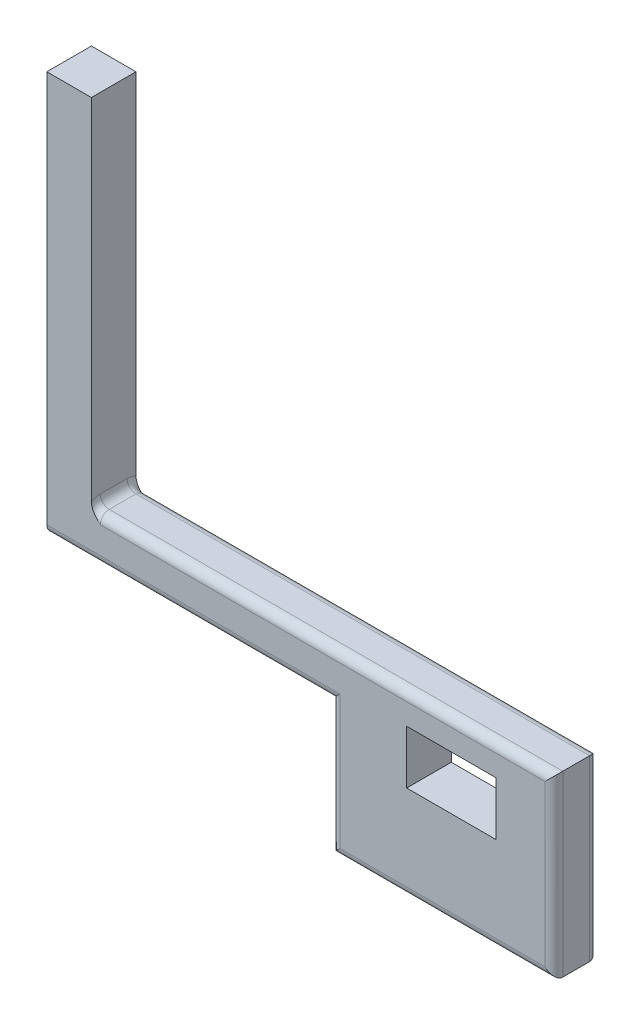
ISO-10303-21;
HEADER;
FILE_DESCRIPTION(('STEP AP214'),'2;1');
FILE_NAME('part.step','',(''),(''),'','','');
FILE_SCHEMA(('AUTOMOTIVE_DESIGN { 1 0 10303 214 1 1 1 1 }'));
ENDSEC;
DATA;
#1=APPLICATION_CONTEXT('core data for automotive mechanical design processes');
#2=APPLICATION_PROTOCOL_DEFINITION('international standard','automotive_design',2000,#1);
#3=PRODUCT_CONTEXT('',#1,'mechanical');
#4=PRODUCT('Part','Part','',(#3));
#5=PRODUCT_RELATED_PRODUCT_CATEGORY('part','',(#4));
#6=PRODUCT_DEFINITION_FORMATION('','',#4);
#7=PRODUCT_DEFINITION_CONTEXT('part definition',#1,'design');
#8=PRODUCT_DEFINITION('design','',#6,#7);
#9=PRODUCT_DEFINITION_SHAPE('','',#8);
#10=(LENGTH_UNIT() NAMED_UNIT(*) SI_UNIT(.MILLI.,.METRE.));
#11=(NAMED_UNIT(*) PLANE_ANGLE_UNIT() SI_UNIT($,.RADIAN.));
#12=(NAMED_UNIT(*) SI_UNIT($,.STERADIAN.) SOLID_ANGLE_UNIT());
#13=UNCERTAINTY_MEASURE_WITH_UNIT(LENGTH_MEASURE(1.E-05),#10,'distance_accuracy_value','');
#14=(GEOMETRIC_REPRESENTATION_CONTEXT(3) GLOBAL_UNCERTAINTY_ASSIGNED_CONTEXT((#13)) GLOBAL_UNIT_ASSIGNED_CONTEXT((#10,
#11,#12)) REPRESENTATION_CONTEXT('',''));
#15=CARTESIAN_POINT('',(0.,0.,0.));
#16=DIRECTION('',(0.,0.,1.));
#17=DIRECTION('',(1.,0.,0.));
#18=AXIS2_PLACEMENT_3D('',#15,#16,#17);
#19=CARTESIAN_POINT('',(6.,1.,0.));
#20=DIRECTION('',(0.,0.,-1.));
#21=DIRECTION('',(-1.,0.,0.));
#22=AXIS2_PLACEMENT_3D('',#19,#20,#21);
#23=CYLINDRICAL_SURFACE('',#22,1.);
#24=CARTESIAN_POINT('',(6.,1.,-1.));
#25=DIRECTION('',(0.,0.,-1.));
#26=DIRECTION('',(-1.,0.,0.));
#27=AXIS2_PLACEMENT_3D('',#24,#25,#26);
#28=CIRCLE('',#27,1.);
#29=CARTESIAN_POINT('',(6.,0.,-1.));
#30=VERTEX_POINT('',#29);
#31=CARTESIAN_POINT('',(5.,1.,-1.));
#32=VERTEX_POINT('',#31);
#33=EDGE_CURVE('E47',#30,#32,#28,.T.);
#34=ORIENTED_EDGE('',*,*,#33,.F.);
#35=DIRECTION('',(0.,0.,1.));
#36=VECTOR('',#35,1.);
#37=CARTESIAN_POINT('',(6.,0.,0.));
#38=LINE('',#37,#36);
#39=CARTESIAN_POINT('',(6.,0.,-4.));
#40=VERTEX_POINT('',#39);
#41=EDGE_CURVE('E338',#40,#30,#38,.T.);
#42=ORIENTED_EDGE('',*,*,#41,.F.);
#43=CARTESIAN_POINT('',(6.,1.,-4.));
#44=DIRECTION('',(0.,0.,-1.));
#45=DIRECTION('',(-1.,0.,0.));
#46=AXIS2_PLACEMENT_3D('',#43,#44,#45);
#47=CIRCLE('',#46,1.);
#48=CARTESIAN_POINT('',(5.,1.,-4.));
#49=VERTEX_POINT('',#48);
#50=EDGE_CURVE('E351',#40,#49,#47,.T.);
#51=ORIENTED_EDGE('',*,*,#50,.T.);
#52=DIRECTION('',(0.,0.,1.));
#53=VECTOR('',#52,1.);
#54=CARTESIAN_POINT('',(5.,1.,0.));
#55=LINE('',#54,#53);
#56=EDGE_CURVE('E332',#32,#49,#55,.F.);
#57=ORIENTED_EDGE('',*,*,#56,.F.);
#58=EDGE_LOOP('',(#34,#42,#51,#57));
#59=FACE_BOUND('',#58,.T.);
#60=ADVANCED_FACE('F36',(#59),#23,.F.);
#61=CARTESIAN_POINT('',(6.,-1.,-4.));
#62=DIRECTION('',(-1.,0.,0.));
#63=DIRECTION('',(0.,0.,1.));
#64=AXIS2_PLACEMENT_3D('',#61,#62,#63);
#65=TOROIDAL_SURFACE('',#64,2.,1.);
#66=ORIENTED_EDGE('',*,*,#50,.F.);
#67=CARTESIAN_POINT('',(6.,-1.,-4.));
#68=DIRECTION('',(-1.,0.,0.));
#69=DIRECTION('',(0.,0.,1.));
#70=AXIS2_PLACEMENT_3D('',#67,#68,#69);
#71=CIRCLE('',#70,1.);
#72=CARTESIAN_POINT('',(6.,-1.,-5.));
#73=VERTEX_POINT('',#72);
#74=EDGE_CURVE('E326',#73,#40,#71,.F.);
#75=ORIENTED_EDGE('',*,*,#74,.F.);
#76=CARTESIAN_POINT('',(5.,0.732050807568877,-5.));
#77=CARTESIAN_POINT('',(4.99999719638696,0.689195278692768,-5.));
#78=CARTESIAN_POINT('',(5.00206602766505,0.646376621920584,-5.));
#79=CARTESIAN_POINT('',(5.01007196565001,0.561164511757952,-5.));
#80=CARTESIAN_POINT('',(5.01600318556927,0.518770510816862,-5.));
#81=CARTESIAN_POINT('',(5.0389948978127,0.393613194754044,-5.));
#82=CARTESIAN_POINT('',(5.06126812700593,0.31178455761488,-5.));
#83=CARTESIAN_POINT('',(5.12790134045868,0.12264168703886,-5.));
#84=CARTESIAN_POINT('',(5.17739633549624,0.0171769878001356,-5.));
#85=CARTESIAN_POINT('',(5.29230484344295,-0.185090579729538,-5.));
#86=CARTESIAN_POINT('',(5.35780578217849,-0.281841740540539,-5.));
#87=CARTESIAN_POINT('',(5.51342065488181,-0.486281245928284,-5.));
#88=CARTESIAN_POINT('',(5.60582936815522,-0.592169206605049,-5.));
#89=CARTESIAN_POINT('',(5.79732403200055,-0.79722762958856,-5.));
#90=CARTESIAN_POINT('',(5.89640470652271,-0.896403278247535,-5.));
#91=CARTESIAN_POINT('',(5.99701857764626,-0.997018576428927,-5.));
#92=CARTESIAN_POINT('',(5.99850928967799,-0.998509288441896,-5.));
#93=CARTESIAN_POINT('',(6.,-1.,-5.));
#94=B_SPLINE_CURVE_WITH_KNOTS('',3,(#76,#77,#78,#79,#80,#81,#82,#83,#84,#85,#86,#87,#88,#89,#90,
#91,#92,#93),.UNSPECIFIED.,.F.,.F.,(4,2,2,2,2,2,2,2,4),(0.,0.128456249212728,0.256717171022984,
0.510014180776442,0.857583473002377,1.20709540467853,1.62797108908905,2.04851777580516,
2.05484233112552),.UNSPECIFIED.);
#95=CARTESIAN_POINT('',(5.,0.732050807568877,-5.));
#96=VERTEX_POINT('',#95);
#97=EDGE_CURVE('E344',#73,#96,#94,.F.);
#98=ORIENTED_EDGE('',*,*,#97,.T.);
#99=CARTESIAN_POINT('',(5.,-1.,-4.));
#100=DIRECTION('',(-1.,0.,0.));
#101=DIRECTION('',(0.,0.,1.));
#102=AXIS2_PLACEMENT_3D('',#99,#100,#101);
#103=CIRCLE('',#102,2.);
#104=EDGE_CURVE('E335',#49,#96,#103,.T.);
#105=ORIENTED_EDGE('',*,*,#104,.F.);
#106=EDGE_LOOP('',(#66,#75,#98,#105));
#107=FACE_BOUND('',#106,.T.);
#108=ADVANCED_FACE('F356',(#107),#65,.F.);
#109=CARTESIAN_POINT('',(6.,-1.,-1.));
#110=DIRECTION('',(-1.,0.,0.));
#111=DIRECTION('',(0.,0.,1.));
#112=AXIS2_PLACEMENT_3D('',#109,#110,#111);
#113=TOROIDAL_SURFACE('',#112,2.,1.);
#114=CARTESIAN_POINT('',(6.,-1.,-1.));
#115=DIRECTION('',(-1.,0.,0.));
#116=DIRECTION('',(0.,0.,1.));
#117=AXIS2_PLACEMENT_3D('',#114,#115,#116);
#118=CIRCLE('',#117,1.);
#119=CARTESIAN_POINT('',(6.,-1.,0.));
#120=VERTEX_POINT('',#119);
#121=EDGE_CURVE('E341',#30,#120,#118,.F.);
#122=ORIENTED_EDGE('',*,*,#121,.F.);
#123=ORIENTED_EDGE('',*,*,#33,.T.);
#124=CARTESIAN_POINT('',(5.,-1.,-1.));
#125=DIRECTION('',(-1.,0.,0.));
#126=DIRECTION('',(0.,0.,1.));
#127=AXIS2_PLACEMENT_3D('',#124,#125,#126);
#128=CIRCLE('',#127,2.);
#129=CARTESIAN_POINT('',(5.,0.732050807568877,0.));
#130=VERTEX_POINT('',#129);
#131=EDGE_CURVE('E329',#130,#32,#128,.T.);
#132=ORIENTED_EDGE('',*,*,#131,.F.);
#133=CARTESIAN_POINT('',(5.,0.732050807568877,0.));
#134=CARTESIAN_POINT('',(4.99999719638696,0.689195278692768,0.));
#135=CARTESIAN_POINT('',(5.00206602766505,0.646376621920584,0.));
#136=CARTESIAN_POINT('',(5.01007196565001,0.561164511757952,0.));
#137=CARTESIAN_POINT('',(5.01600318556927,0.518770510816862,0.));
#138=CARTESIAN_POINT('',(5.0389948978127,0.393613194754044,0.));
#139=CARTESIAN_POINT('',(5.06126812700593,0.31178455761488,0.));
#140=CARTESIAN_POINT('',(5.12790134045868,0.12264168703886,0.));
#141=CARTESIAN_POINT('',(5.17739633549624,0.0171769878001356,0.));
#142=CARTESIAN_POINT('',(5.29230484344295,-0.185090579729538,0.));
#143=CARTESIAN_POINT('',(5.35780578217849,-0.281841740540539,0.));
#144=CARTESIAN_POINT('',(5.51342065488181,-0.486281245928284,0.));
#145=CARTESIAN_POINT('',(5.60582936815522,-0.592169206605049,0.));
#146=CARTESIAN_POINT('',(5.79732403200055,-0.797227629588561,0.));
#147=CARTESIAN_POINT('',(5.89640470652271,-0.896403278247535,0.));
#148=CARTESIAN_POINT('',(5.99701857764626,-0.997018576428927,0.));
#149=CARTESIAN_POINT('',(5.99850928967799,-0.998509288441896,0.));
#150=CARTESIAN_POINT('',(6.,-1.,0.));
#151=B_SPLINE_CURVE_WITH_KNOTS('',3,(#133,#134,#135,#136,#137,#138,#139,#140,#141,#142,#143,
#144,#145,#146,#147,#148,#149,#150),.UNSPECIFIED.,.F.,.F.,(4,2,2,2,2,2,2,2,4),(0.,
0.128456249212728,0.256717171022984,0.510014180776442,0.857583473002377,1.20709540467853,
1.62797108908905,2.04851777580516,2.05484233112552),.UNSPECIFIED.);
#152=EDGE_CURVE('E11',#130,#120,#151,.T.);
#153=ORIENTED_EDGE('',*,*,#152,.T.);
#154=EDGE_LOOP('',(#122,#123,#132,#153));
#155=FACE_BOUND('',#154,.T.);
#156=ADVANCED_FACE('F360',(#155),#113,.F.);
#157=CARTESIAN_POINT('',(32.86,40.,-4.));
#158=DIRECTION('',(0.,1.,0.));
#159=DIRECTION('',(0.,0.,1.));
#160=AXIS2_PLACEMENT_3D('',#157,#158,#159);
#161=CYLINDRICAL_SURFACE('',#160,1.);
#162=CARTESIAN_POINT('',(32.86,-4.,-4.));
#163=DIRECTION('',(-0.707106781186547,0.707106781186547,0.));
#164=DIRECTION('',(0.707106781186547,0.707106781186547,0.));
#165=AXIS2_PLACEMENT_3D('',#162,#163,#164);
#166=ELLIPSE('',#165,1.41421356237309,1.);
#167=CARTESIAN_POINT('',(32.86,-4.,-5.));
#168=VERTEX_POINT('',#167);
#169=CARTESIAN_POINT('',(31.86,-5.,-4.));
#170=VERTEX_POINT('',#169);
#171=EDGE_CURVE('E324',#168,#170,#166,.T.);
#172=ORIENTED_EDGE('',*,*,#171,.F.);
#173=DIRECTION('',(0.,1.,0.));
#174=VECTOR('',#173,1.);
#175=CARTESIAN_POINT('',(32.86,40.,-5.));
#176=LINE('',#175,#174);
#177=CARTESIAN_POINT('',(32.86,-19.,-5.));
#178=VERTEX_POINT('',#177);
#179=EDGE_CURVE('E290',#178,#168,#176,.T.);
#180=ORIENTED_EDGE('',*,*,#179,.F.);
#181=CARTESIAN_POINT('',(32.86,-19.,-4.));
#182=DIRECTION('',(-0.707106781186547,0.707106781186547,0.));
#183=DIRECTION('',(0.707106781186547,0.707106781186547,0.));
#184=AXIS2_PLACEMENT_3D('',#181,#182,#183);
#185=ELLIPSE('',#184,1.41421356237309,1.);
#186=CARTESIAN_POINT('',(31.86,-20.,-4.));
#187=VERTEX_POINT('',#186);
#188=EDGE_CURVE('E322',#178,#187,#185,.T.);
#189=ORIENTED_EDGE('',*,*,#188,.T.);
#190=DIRECTION('',(0.,1.,0.));
#191=VECTOR('',#190,1.);
#192=CARTESIAN_POINT('',(31.86,-20.,-4.));
#193=LINE('',#192,#191);
#194=EDGE_CURVE('E310',#170,#187,#193,.F.);
#195=ORIENTED_EDGE('',*,*,#194,.F.);
#196=EDGE_LOOP('',(#172,#180,#189,#195));
#197=FACE_BOUND('',#196,.T.);
#198=ADVANCED_FACE('F366',(#197),#161,.T.);
#199=CARTESIAN_POINT('',(0.,-19.,-4.));
#200=DIRECTION('',(-1.,0.,0.));
#201=DIRECTION('',(0.,0.,1.));
#202=AXIS2_PLACEMENT_3D('',#199,#200,#201);
#203=CYLINDRICAL_SURFACE('',#202,1.);
#204=ORIENTED_EDGE('',*,*,#188,.F.);
#205=DIRECTION('',(-1.,0.,0.));
#206=VECTOR('',#205,1.);
#207=CARTESIAN_POINT('',(0.,-19.,-5.));
#208=LINE('',#207,#206);
#209=CARTESIAN_POINT('',(55.86,-19.,-5.));
#210=VERTEX_POINT('',#209);
#211=EDGE_CURVE('E293',#210,#178,#208,.T.);
#212=ORIENTED_EDGE('',*,*,#211,.F.);
#213=CARTESIAN_POINT('',(55.86,-19.,-4.));
#214=DIRECTION('',(-0.707106781186547,-0.707106781186547,0.));
#215=DIRECTION('',(-0.707106781186547,0.707106781186547,0.));
#216=AXIS2_PLACEMENT_3D('',#213,#214,#215);
#217=ELLIPSE('',#216,1.41421356237309,1.);
#218=CARTESIAN_POINT('',(56.86,-20.,-4.));
#219=VERTEX_POINT('',#218);
#220=EDGE_CURVE('E320',#210,#219,#217,.T.);
#221=ORIENTED_EDGE('',*,*,#220,.T.);
#222=DIRECTION('',(-1.,0.,0.));
#223=VECTOR('',#222,1.);
#224=CARTESIAN_POINT('',(0.,-20.,-4.));
#225=LINE('',#224,#223);
#226=EDGE_CURVE('E307',#187,#219,#225,.F.);
#227=ORIENTED_EDGE('',*,*,#226,.F.);
#228=EDGE_LOOP('',(#204,#212,#221,#227));
#229=FACE_BOUND('',#228,.T.);
#230=ADVANCED_FACE('F371',(#229),#203,.T.);
#231=CARTESIAN_POINT('',(55.86,40.,-4.));
#232=DIRECTION('',(0.,1.,0.));
#233=DIRECTION('',(0.,0.,1.));
#234=AXIS2_PLACEMENT_3D('',#231,#232,#233);
#235=CYLINDRICAL_SURFACE('',#234,1.);
#236=ORIENTED_EDGE('',*,*,#220,.F.);
#237=DIRECTION('',(0.,-1.,0.));
#238=VECTOR('',#237,1.);
#239=CARTESIAN_POINT('',(55.86,40.,-5.));
#240=LINE('',#239,#238);
#241=CARTESIAN_POINT('',(55.86,-1.,-5.));
#242=VERTEX_POINT('',#241);
#243=EDGE_CURVE('E296',#242,#210,#240,.T.);
#244=ORIENTED_EDGE('',*,*,#243,.F.);
#245=CARTESIAN_POINT('',(55.86,-1.,-4.));
#246=DIRECTION('',(-0.707106781186547,0.707106781186547,0.));
#247=DIRECTION('',(0.707106781186547,0.707106781186547,0.));
#248=AXIS2_PLACEMENT_3D('',#245,#246,#247);
#249=ELLIPSE('',#248,1.41421356237309,1.);
#250=CARTESIAN_POINT('',(56.86,0.,-4.));
#251=VERTEX_POINT('',#250);
#252=EDGE_CURVE('E318',#242,#251,#249,.F.);
#253=ORIENTED_EDGE('',*,*,#252,.T.);
#254=DIRECTION('',(0.,-1.,0.));
#255=VECTOR('',#254,1.);
#256=CARTESIAN_POINT('',(56.86,40.,-4.));
#257=LINE('',#256,#255);
#258=EDGE_CURVE('E304',#219,#251,#257,.F.);
#259=ORIENTED_EDGE('',*,*,#258,.F.);
#260=EDGE_LOOP('',(#236,#244,#253,#259));
#261=FACE_BOUND('',#260,.T.);
#262=ADVANCED_FACE('F429',(#261),#235,.T.);
#263=CARTESIAN_POINT('',(0.,-1.,-4.));
#264=DIRECTION('',(1.,0.,0.));
#265=DIRECTION('',(0.,0.,-1.));
#266=AXIS2_PLACEMENT_3D('',#263,#264,#265);
#267=CYLINDRICAL_SURFACE('',#266,1.);
#268=DIRECTION('',(1.,0.,0.));
#269=VECTOR('',#268,1.);
#270=CARTESIAN_POINT('',(0.,-1.,-5.));
#271=LINE('',#270,#269);
#272=EDGE_CURVE('E299',#73,#242,#271,.T.);
#273=ORIENTED_EDGE('',*,*,#272,.F.);
#274=ORIENTED_EDGE('',*,*,#74,.T.);
#275=DIRECTION('',(1.,0.,0.));
#276=VECTOR('',#275,1.);
#277=CARTESIAN_POINT('',(0.,0.,-4.));
#278=LINE('',#277,#276);
#279=EDGE_CURVE('E301',#251,#40,#278,.F.);
#280=ORIENTED_EDGE('',*,*,#279,.F.);
#281=ORIENTED_EDGE('',*,*,#252,.F.);
#282=EDGE_LOOP('',(#273,#274,#280,#281));
#283=FACE_BOUND('',#282,.T.);
#284=ADVANCED_FACE('F402',(#283),#267,.T.);
#285=CARTESIAN_POINT('',(0.,-4.,-4.));
#286=DIRECTION('',(1.,0.,0.));
#287=DIRECTION('',(0.,0.,-1.));
#288=AXIS2_PLACEMENT_3D('',#285,#286,#287);
#289=CYLINDRICAL_SURFACE('',#288,1.);
#290=DIRECTION('',(-1.,0.,0.));
#291=VECTOR('',#290,1.);
#292=CARTESIAN_POINT('',(0.,-4.,-5.));
#293=LINE('',#292,#291);
#294=CARTESIAN_POINT('',(0.,-4.,-5.));
#295=VERTEX_POINT('',#294);
#296=EDGE_CURVE('E287',#168,#295,#293,.T.);
#297=ORIENTED_EDGE('',*,*,#296,.F.);
#298=ORIENTED_EDGE('',*,*,#171,.T.);
#299=DIRECTION('',(-1.,0.,0.));
#300=VECTOR('',#299,1.);
#301=CARTESIAN_POINT('',(0.,-5.,-4.));
#302=LINE('',#301,#300);
#303=CARTESIAN_POINT('',(0.,-5.,-4.));
#304=VERTEX_POINT('',#303);
#305=EDGE_CURVE('E313',#304,#170,#302,.F.);
#306=ORIENTED_EDGE('',*,*,#305,.F.);
#307=CARTESIAN_POINT('',(0.,-4.,-4.));
#308=DIRECTION('',(1.,0.,0.));
#309=DIRECTION('',(0.,0.,-1.));
#310=AXIS2_PLACEMENT_3D('',#307,#308,#309);
#311=CIRCLE('',#310,1.);
#312=EDGE_CURVE('E316',#295,#304,#311,.F.);
#313=ORIENTED_EDGE('',*,*,#312,.F.);
#314=EDGE_LOOP('',(#297,#298,#306,#313));
#315=FACE_BOUND('',#314,.T.);
#316=ADVANCED_FACE('F362',(#315),#289,.T.);
#317=CARTESIAN_POINT('',(55.86,40.,-1.));
#318=DIRECTION('',(0.,-1.,0.));
#319=DIRECTION('',(0.,0.,-1.));
#320=AXIS2_PLACEMENT_3D('',#317,#318,#319);
#321=CYLINDRICAL_SURFACE('',#320,1.);
#322=CARTESIAN_POINT('',(55.86,-1.,-1.));
#323=DIRECTION('',(-0.707106781186547,0.707106781186547,0.));
#324=DIRECTION('',(-0.707106781186547,-0.707106781186547,0.));
#325=AXIS2_PLACEMENT_3D('',#322,#323,#324);
#326=ELLIPSE('',#325,1.41421356237309,1.);
#327=CARTESIAN_POINT('',(55.86,-1.,0.));
#328=VERTEX_POINT('',#327);
#329=CARTESIAN_POINT('',(56.86,0.,-1.));
#330=VERTEX_POINT('',#329);
#331=EDGE_CURVE('E284',#328,#330,#326,.T.);
#332=ORIENTED_EDGE('',*,*,#331,.F.);
#333=DIRECTION('',(0.,1.,0.));
#334=VECTOR('',#333,1.);
#335=CARTESIAN_POINT('',(55.86,40.,0.));
#336=LINE('',#335,#334);
#337=CARTESIAN_POINT('',(55.86,-19.,0.));
#338=VERTEX_POINT('',#337);
#339=EDGE_CURVE('E249',#338,#328,#336,.T.);
#340=ORIENTED_EDGE('',*,*,#339,.F.);
#341=CARTESIAN_POINT('',(55.86,-19.,-1.));
#342=DIRECTION('',(-0.707106781186547,-0.707106781186547,0.));
#343=DIRECTION('',(0.707106781186547,-0.707106781186547,0.));
#344=AXIS2_PLACEMENT_3D('',#341,#342,#343);
#345=ELLIPSE('',#344,1.41421356237309,1.);
#346=CARTESIAN_POINT('',(56.86,-20.,-1.));
#347=VERTEX_POINT('',#346);
#348=EDGE_CURVE('E281',#338,#347,#345,.F.);
#349=ORIENTED_EDGE('',*,*,#348,.T.);
#350=DIRECTION('',(0.,1.,0.));
#351=VECTOR('',#350,1.);
#352=CARTESIAN_POINT('',(56.86,40.,-1.));
#353=LINE('',#352,#351);
#354=EDGE_CURVE('E272',#330,#347,#353,.F.);
#355=ORIENTED_EDGE('',*,*,#354,.F.);
#356=EDGE_LOOP('',(#332,#340,#349,#355));
#357=FACE_BOUND('',#356,.T.);
#358=ADVANCED_FACE('F392',(#357),#321,.T.);
#359=CARTESIAN_POINT('',(0.,-19.,-1.));
#360=DIRECTION('',(1.,0.,0.));
#361=DIRECTION('',(0.,0.,-1.));
#362=AXIS2_PLACEMENT_3D('',#359,#360,#361);
#363=CYLINDRICAL_SURFACE('',#362,1.);
#364=ORIENTED_EDGE('',*,*,#348,.F.);
#365=DIRECTION('',(1.,0.,0.));
#366=VECTOR('',#365,1.);
#367=CARTESIAN_POINT('',(0.,-19.,0.));
#368=LINE('',#367,#366);
#369=CARTESIAN_POINT('',(32.86,-19.,0.));
#370=VERTEX_POINT('',#369);
#371=EDGE_CURVE('E252',#370,#338,#368,.T.);
#372=ORIENTED_EDGE('',*,*,#371,.F.);
#373=CARTESIAN_POINT('',(32.86,-19.,-1.));
#374=DIRECTION('',(0.707106781186547,-0.707106781186547,0.));
#375=DIRECTION('',(0.707106781186547,0.707106781186547,0.));
#376=AXIS2_PLACEMENT_3D('',#373,#374,#375);
#377=ELLIPSE('',#376,1.41421356237309,1.);
#378=CARTESIAN_POINT('',(31.86,-20.,-1.));
#379=VERTEX_POINT('',#378);
#380=EDGE_CURVE('E279',#370,#379,#377,.T.);
#381=ORIENTED_EDGE('',*,*,#380,.T.);
#382=DIRECTION('',(1.,0.,0.));
#383=VECTOR('',#382,1.);
#384=CARTESIAN_POINT('',(0.,-20.,-1.));
#385=LINE('',#384,#383);
#386=EDGE_CURVE('E269',#347,#379,#385,.F.);
#387=ORIENTED_EDGE('',*,*,#386,.F.);
#388=EDGE_LOOP('',(#364,#372,#381,#387));
#389=FACE_BOUND('',#388,.T.);
#390=ADVANCED_FACE('F414',(#389),#363,.T.);
#391=CARTESIAN_POINT('',(32.86,40.,-1.));
#392=DIRECTION('',(0.,-1.,0.));
#393=DIRECTION('',(0.,0.,-1.));
#394=AXIS2_PLACEMENT_3D('',#391,#392,#393);
#395=CYLINDRICAL_SURFACE('',#394,1.);
#396=ORIENTED_EDGE('',*,*,#380,.F.);
#397=DIRECTION('',(0.,-1.,0.));
#398=VECTOR('',#397,1.);
#399=CARTESIAN_POINT('',(32.86,40.,0.));
#400=LINE('',#399,#398);
#401=CARTESIAN_POINT('',(32.86,-4.,0.));
#402=VERTEX_POINT('',#401);
#403=EDGE_CURVE('E255',#402,#370,#400,.T.);
#404=ORIENTED_EDGE('',*,*,#403,.F.);
#405=CARTESIAN_POINT('',(32.86,-4.,-1.));
#406=DIRECTION('',(-0.707106781186547,0.707106781186547,0.));
#407=DIRECTION('',(-0.707106781186547,-0.707106781186547,0.));
#408=AXIS2_PLACEMENT_3D('',#405,#406,#407);
#409=ELLIPSE('',#408,1.41421356237309,1.);
#410=CARTESIAN_POINT('',(31.86,-5.,-1.));
#411=VERTEX_POINT('',#410);
#412=EDGE_CURVE('E277',#402,#411,#409,.F.);
#413=ORIENTED_EDGE('',*,*,#412,.T.);
#414=DIRECTION('',(0.,-1.,0.));
#415=VECTOR('',#414,1.);
#416=CARTESIAN_POINT('',(31.86,-20.,-1.));
#417=LINE('',#416,#415);
#418=EDGE_CURVE('E266',#379,#411,#417,.F.);
#419=ORIENTED_EDGE('',*,*,#418,.F.);
#420=EDGE_LOOP('',(#396,#404,#413,#419));
#421=FACE_BOUND('',#420,.T.);
#422=ADVANCED_FACE('F420',(#421),#395,.T.);
#423=CARTESIAN_POINT('',(0.,-4.,-1.));
#424=DIRECTION('',(-1.,0.,0.));
#425=DIRECTION('',(0.,0.,1.));
#426=AXIS2_PLACEMENT_3D('',#423,#424,#425);
#427=CYLINDRICAL_SURFACE('',#426,1.);
#428=ORIENTED_EDGE('',*,*,#412,.F.);
#429=DIRECTION('',(1.,0.,0.));
#430=VECTOR('',#429,1.);
#431=CARTESIAN_POINT('',(0.,-4.,0.));
#432=LINE('',#431,#430);
#433=CARTESIAN_POINT('',(0.,-4.,0.));
#434=VERTEX_POINT('',#433);
#435=EDGE_CURVE('E258',#434,#402,#432,.T.);
#436=ORIENTED_EDGE('',*,*,#435,.F.);
#437=CARTESIAN_POINT('',(0.,-4.,-1.));
#438=DIRECTION('',(1.,0.,0.));
#439=DIRECTION('',(0.,0.,-1.));
#440=AXIS2_PLACEMENT_3D('',#437,#438,#439);
#441=CIRCLE('',#440,1.);
#442=CARTESIAN_POINT('',(0.,-5.,-1.));
#443=VERTEX_POINT('',#442);
#444=EDGE_CURVE('E264',#443,#434,#441,.F.);
#445=ORIENTED_EDGE('',*,*,#444,.F.);
#446=DIRECTION('',(1.,0.,0.));
#447=VECTOR('',#446,1.);
#448=CARTESIAN_POINT('',(0.,-5.,-1.));
#449=LINE('',#448,#447);
#450=EDGE_CURVE('E261',#411,#443,#449,.F.);
#451=ORIENTED_EDGE('',*,*,#450,.F.);
#452=EDGE_LOOP('',(#428,#436,#445,#451));
#453=FACE_BOUND('',#452,.T.);
#454=ADVANCED_FACE('F443',(#453),#427,.T.);
#455=CARTESIAN_POINT('',(0.,-1.,-1.));
#456=DIRECTION('',(-1.,0.,0.));
#457=DIRECTION('',(0.,0.,1.));
#458=AXIS2_PLACEMENT_3D('',#455,#456,#457);
#459=CYLINDRICAL_SURFACE('',#458,1.);
#460=DIRECTION('',(-1.,0.,0.));
#461=VECTOR('',#460,1.);
#462=CARTESIAN_POINT('',(0.,0.,-1.));
#463=LINE('',#462,#461);
#464=EDGE_CURVE('E275',#30,#330,#463,.F.);
#465=ORIENTED_EDGE('',*,*,#464,.F.);
#466=ORIENTED_EDGE('',*,*,#121,.T.);
#467=DIRECTION('',(-1.,0.,0.));
#468=VECTOR('',#467,1.);
#469=CARTESIAN_POINT('',(0.,-1.,0.));
#470=LINE('',#469,#468);
#471=EDGE_CURVE('E246',#328,#120,#470,.T.);
#472=ORIENTED_EDGE('',*,*,#471,.F.);
#473=ORIENTED_EDGE('',*,*,#331,.T.);
#474=EDGE_LOOP('',(#465,#466,#472,#473));
#475=FACE_BOUND('',#474,.T.);
#476=ADVANCED_FACE('F387',(#475),#459,.T.);
#477=CARTESIAN_POINT('',(0.,40.,0.));
#478=DIRECTION('',(1.,0.,0.));
#479=DIRECTION('',(0.,0.,-1.));
#480=AXIS2_PLACEMENT_3D('',#477,#478,#479);
#481=PLANE('',#480);
#482=DIRECTION('',(0.,-1.,0.));
#483=VECTOR('',#482,1.);
#484=CARTESIAN_POINT('',(0.,40.,-5.));
#485=LINE('',#484,#483);
#486=CARTESIAN_POINT('',(0.,40.,-5.));
#487=VERTEX_POINT('',#486);
#488=EDGE_CURVE('E234',#487,#295,#485,.T.);
#489=ORIENTED_EDGE('',*,*,#488,.T.);
#490=ORIENTED_EDGE('',*,*,#312,.T.);
#491=DIRECTION('',(0.,0.,-1.));
#492=VECTOR('',#491,1.);
#493=CARTESIAN_POINT('',(0.,-5.,0.));
#494=LINE('',#493,#492);
#495=EDGE_CURVE('E220',#443,#304,#494,.T.);
#496=ORIENTED_EDGE('',*,*,#495,.F.);
#497=ORIENTED_EDGE('',*,*,#444,.T.);
#498=DIRECTION('',(0.,-1.,0.));
#499=VECTOR('',#498,1.);
#500=CARTESIAN_POINT('',(0.,40.,0.));
#501=LINE('',#500,#499);
#502=CARTESIAN_POINT('',(0.,40.,0.));
#503=VERTEX_POINT('',#502);
#504=EDGE_CURVE('E243',#503,#434,#501,.T.);
#505=ORIENTED_EDGE('',*,*,#504,.F.);
#506=DIRECTION('',(0.,0.,1.));
#507=VECTOR('',#506,1.);
#508=CARTESIAN_POINT('',(0.,40.,0.));
#509=LINE('',#508,#507);
#510=EDGE_CURVE('E223',#487,#503,#509,.T.);
#511=ORIENTED_EDGE('',*,*,#510,.F.);
#512=EDGE_LOOP('',(#489,#490,#496,#497,#505,#511));
#513=FACE_BOUND('',#512,.T.);
#514=ADVANCED_FACE('F439',(#513),#481,.F.);
#515=CARTESIAN_POINT('',(0.,40.,0.));
#516=DIRECTION('',(0.,0.,-1.));
#517=DIRECTION('',(-1.,0.,0.));
#518=AXIS2_PLACEMENT_3D('',#515,#516,#517);
#519=PLANE('',#518);
#520=DIRECTION('',(1.,0.,0.));
#521=VECTOR('',#520,1.);
#522=CARTESIAN_POINT('',(50.36,-3.38,0.));
#523=LINE('',#522,#521);
#524=CARTESIAN_POINT('',(40.36,-3.38,0.));
#525=VERTEX_POINT('',#524);
#526=CARTESIAN_POINT('',(50.36,-3.38,0.));
#527=VERTEX_POINT('',#526);
#528=EDGE_CURVE('E183',#525,#527,#523,.T.);
#529=ORIENTED_EDGE('',*,*,#528,.T.);
#530=DIRECTION('',(0.,-1.,0.));
#531=VECTOR('',#530,1.);
#532=CARTESIAN_POINT('',(50.36,-3.38,0.));
#533=LINE('',#532,#531);
#534=CARTESIAN_POINT('',(50.36,-9.38,0.));
#535=VERTEX_POINT('',#534);
#536=EDGE_CURVE('E177',#527,#535,#533,.T.);
#537=ORIENTED_EDGE('',*,*,#536,.T.);
#538=DIRECTION('',(-1.,0.,0.));
#539=VECTOR('',#538,1.);
#540=CARTESIAN_POINT('',(50.36,-9.38,0.));
#541=LINE('',#540,#539);
#542=CARTESIAN_POINT('',(40.36,-9.38,0.));
#543=VERTEX_POINT('',#542);
#544=EDGE_CURVE('E186',#535,#543,#541,.T.);
#545=ORIENTED_EDGE('',*,*,#544,.T.);
#546=DIRECTION('',(0.,1.,0.));
#547=VECTOR('',#546,1.);
#548=CARTESIAN_POINT('',(40.36,-3.38,0.));
#549=LINE('',#548,#547);
#550=EDGE_CURVE('E54',#543,#525,#549,.T.);
#551=ORIENTED_EDGE('',*,*,#550,.T.);
#552=EDGE_LOOP('',(#529,#537,#545,#551));
#553=FACE_BOUND('',#552,.T.);
#554=ORIENTED_EDGE('',*,*,#504,.T.);
#555=ORIENTED_EDGE('',*,*,#435,.T.);
#556=ORIENTED_EDGE('',*,*,#403,.T.);
#557=ORIENTED_EDGE('',*,*,#371,.T.);
#558=ORIENTED_EDGE('',*,*,#339,.T.);
#559=ORIENTED_EDGE('',*,*,#471,.T.);
#560=ORIENTED_EDGE('',*,*,#152,.F.);
#561=DIRECTION('',(0.,-1.,0.));
#562=VECTOR('',#561,1.);
#563=CARTESIAN_POINT('',(5.,40.,0.));
#564=LINE('',#563,#562);
#565=CARTESIAN_POINT('',(5.,40.,0.));
#566=VERTEX_POINT('',#565);
#567=EDGE_CURVE('E240',#566,#130,#564,.T.);
#568=ORIENTED_EDGE('',*,*,#567,.F.);
#569=DIRECTION('',(1.,0.,0.));
#570=VECTOR('',#569,1.);
#571=CARTESIAN_POINT('',(0.,40.,0.));
#572=LINE('',#571,#570);
#573=EDGE_CURVE('E228',#503,#566,#572,.T.);
#574=ORIENTED_EDGE('',*,*,#573,.F.);
#575=EDGE_LOOP('',(#554,#555,#556,#557,#558,#559,#560,#568,#574));
#576=FACE_BOUND('',#575,.T.);
#577=ADVANCED_FACE('F190',(#553,#576),#519,.F.);
#578=CARTESIAN_POINT('',(5.,40.,0.));
#579=DIRECTION('',(-1.,0.,0.));
#580=DIRECTION('',(0.,0.,1.));
#581=AXIS2_PLACEMENT_3D('',#578,#579,#580);
#582=PLANE('',#581);
#583=ORIENTED_EDGE('',*,*,#56,.T.);
#584=ORIENTED_EDGE('',*,*,#104,.T.);
#585=DIRECTION('',(0.,-1.,0.));
#586=VECTOR('',#585,1.);
#587=CARTESIAN_POINT('',(5.,40.,-5.));
#588=LINE('',#587,#586);
#589=CARTESIAN_POINT('',(5.,40.,-5.));
#590=VERTEX_POINT('',#589);
#591=EDGE_CURVE('E237',#590,#96,#588,.T.);
#592=ORIENTED_EDGE('',*,*,#591,.F.);
#593=DIRECTION('',(0.,0.,-1.));
#594=VECTOR('',#593,1.);
#595=CARTESIAN_POINT('',(5.,40.,0.));
#596=LINE('',#595,#594);
#597=EDGE_CURVE('E230',#566,#590,#596,.T.);
#598=ORIENTED_EDGE('',*,*,#597,.F.);
#599=ORIENTED_EDGE('',*,*,#567,.T.);
#600=ORIENTED_EDGE('',*,*,#131,.T.);
#601=EDGE_LOOP('',(#583,#584,#592,#598,#599,#600));
#602=FACE_BOUND('',#601,.T.);
#603=ADVANCED_FACE('F408',(#602),#582,.F.);
#604=CARTESIAN_POINT('',(0.,40.,-5.));
#605=DIRECTION('',(0.,0.,1.));
#606=DIRECTION('',(1.,0.,0.));
#607=AXIS2_PLACEMENT_3D('',#604,#605,#606);
#608=PLANE('',#607);
#609=DIRECTION('',(-1.,0.,0.));
#610=VECTOR('',#609,1.);
#611=CARTESIAN_POINT('',(50.36,-9.38,-5.));
#612=LINE('',#611,#610);
#613=CARTESIAN_POINT('',(50.36,-9.38,-5.));
#614=VERTEX_POINT('',#613);
#615=CARTESIAN_POINT('',(40.36,-9.38,-5.));
#616=VERTEX_POINT('',#615);
#617=EDGE_CURVE('E202',#614,#616,#612,.T.);
#618=ORIENTED_EDGE('',*,*,#617,.F.);
#619=DIRECTION('',(0.,-1.,0.));
#620=VECTOR('',#619,1.);
#621=CARTESIAN_POINT('',(50.36,-3.38,-5.));
#622=LINE('',#621,#620);
#623=CARTESIAN_POINT('',(50.36,-3.38,-5.));
#624=VERTEX_POINT('',#623);
#625=EDGE_CURVE('E62',#624,#614,#622,.T.);
#626=ORIENTED_EDGE('',*,*,#625,.F.);
#627=DIRECTION('',(1.,0.,0.));
#628=VECTOR('',#627,1.);
#629=CARTESIAN_POINT('',(50.36,-3.38,-5.));
#630=LINE('',#629,#628);
#631=CARTESIAN_POINT('',(40.36,-3.38,-5.));
#632=VERTEX_POINT('',#631);
#633=EDGE_CURVE('E193',#632,#624,#630,.T.);
#634=ORIENTED_EDGE('',*,*,#633,.F.);
#635=DIRECTION('',(0.,1.,0.));
#636=VECTOR('',#635,1.);
#637=CARTESIAN_POINT('',(40.36,-3.38,-5.));
#638=LINE('',#637,#636);
#639=EDGE_CURVE('E196',#616,#632,#638,.T.);
#640=ORIENTED_EDGE('',*,*,#639,.F.);
#641=EDGE_LOOP('',(#618,#626,#634,#640));
#642=FACE_BOUND('',#641,.T.);
#643=ORIENTED_EDGE('',*,*,#97,.F.);
#644=ORIENTED_EDGE('',*,*,#272,.T.);
#645=ORIENTED_EDGE('',*,*,#243,.T.);
#646=ORIENTED_EDGE('',*,*,#211,.T.);
#647=ORIENTED_EDGE('',*,*,#179,.T.);
#648=ORIENTED_EDGE('',*,*,#296,.T.);
#649=ORIENTED_EDGE('',*,*,#488,.F.);
#650=DIRECTION('',(-1.,0.,0.));
#651=VECTOR('',#650,1.);
#652=CARTESIAN_POINT('',(0.,40.,-5.));
#653=LINE('',#652,#651);
#654=EDGE_CURVE('E232',#590,#487,#653,.T.);
#655=ORIENTED_EDGE('',*,*,#654,.F.);
#656=ORIENTED_EDGE('',*,*,#591,.T.);
#657=EDGE_LOOP('',(#643,#644,#645,#646,#647,#648,#649,#655,#656));
#658=FACE_BOUND('',#657,.T.);
#659=ADVANCED_FACE('F352',(#642,#658),#608,.F.);
#660=CARTESIAN_POINT('',(0.,40.,0.));
#661=DIRECTION('',(0.,-1.,0.));
#662=DIRECTION('',(0.,0.,-1.));
#663=AXIS2_PLACEMENT_3D('',#660,#661,#662);
#664=PLANE('',#663);
#665=ORIENTED_EDGE('',*,*,#510,.T.);
#666=ORIENTED_EDGE('',*,*,#573,.T.);
#667=ORIENTED_EDGE('',*,*,#597,.T.);
#668=ORIENTED_EDGE('',*,*,#654,.T.);
#669=EDGE_LOOP('',(#665,#666,#667,#668));
#670=FACE_BOUND('',#669,.T.);
#671=ADVANCED_FACE('F436',(#670),#664,.F.);
#672=CARTESIAN_POINT('',(56.86,-5.,0.));
#673=DIRECTION('',(1.,0.,0.));
#674=DIRECTION('',(0.,0.,-1.));
#675=AXIS2_PLACEMENT_3D('',#672,#673,#674);
#676=PLANE('',#675);
#677=DIRECTION('',(0.,0.,1.));
#678=VECTOR('',#677,1.);
#679=CARTESIAN_POINT('',(56.86,-20.,0.));
#680=LINE('',#679,#678);
#681=EDGE_CURVE('E212',#219,#347,#680,.T.);
#682=ORIENTED_EDGE('',*,*,#681,.F.);
#683=ORIENTED_EDGE('',*,*,#258,.T.);
#684=DIRECTION('',(0.,0.,-1.));
#685=VECTOR('',#684,1.);
#686=CARTESIAN_POINT('',(56.86,0.,0.));
#687=LINE('',#686,#685);
#688=EDGE_CURVE('E217',#330,#251,#687,.T.);
#689=ORIENTED_EDGE('',*,*,#688,.F.);
#690=ORIENTED_EDGE('',*,*,#354,.T.);
#691=EDGE_LOOP('',(#682,#683,#689,#690));
#692=FACE_BOUND('',#691,.T.);
#693=ADVANCED_FACE('F396',(#692),#676,.T.);
#694=CARTESIAN_POINT('',(0.,-5.,0.));
#695=DIRECTION('',(0.,-1.,0.));
#696=DIRECTION('',(0.,0.,-1.));
#697=AXIS2_PLACEMENT_3D('',#694,#695,#696);
#698=PLANE('',#697);
#699=ORIENTED_EDGE('',*,*,#495,.T.);
#700=ORIENTED_EDGE('',*,*,#305,.T.);
#701=DIRECTION('',(0.,0.,-1.));
#702=VECTOR('',#701,1.);
#703=CARTESIAN_POINT('',(31.86,-5.,0.));
#704=LINE('',#703,#702);
#705=EDGE_CURVE('E208',#411,#170,#704,.T.);
#706=ORIENTED_EDGE('',*,*,#705,.F.);
#707=ORIENTED_EDGE('',*,*,#450,.T.);
#708=EDGE_LOOP('',(#699,#700,#706,#707));
#709=FACE_BOUND('',#708,.T.);
#710=ADVANCED_FACE('F445',(#709),#698,.T.);
#711=CARTESIAN_POINT('',(0.,0.,0.));
#712=DIRECTION('',(0.,-1.,0.));
#713=DIRECTION('',(0.,0.,-1.));
#714=AXIS2_PLACEMENT_3D('',#711,#712,#713);
#715=PLANE('',#714);
#716=ORIENTED_EDGE('',*,*,#279,.T.);
#717=ORIENTED_EDGE('',*,*,#41,.T.);
#718=ORIENTED_EDGE('',*,*,#464,.T.);
#719=ORIENTED_EDGE('',*,*,#688,.T.);
#720=EDGE_LOOP('',(#716,#717,#718,#719));
#721=FACE_BOUND('',#720,.T.);
#722=ADVANCED_FACE('F385',(#721),#715,.F.);
#723=CARTESIAN_POINT('',(31.86,-20.,0.));
#724=DIRECTION('',(1.,0.,0.));
#725=DIRECTION('',(0.,0.,-1.));
#726=AXIS2_PLACEMENT_3D('',#723,#724,#725);
#727=PLANE('',#726);
#728=ORIENTED_EDGE('',*,*,#705,.T.);
#729=ORIENTED_EDGE('',*,*,#194,.T.);
#730=DIRECTION('',(0.,0.,-1.));
#731=VECTOR('',#730,1.);
#732=CARTESIAN_POINT('',(31.86,-20.,0.));
#733=LINE('',#732,#731);
#734=EDGE_CURVE('E214',#379,#187,#733,.T.);
#735=ORIENTED_EDGE('',*,*,#734,.F.);
#736=ORIENTED_EDGE('',*,*,#418,.T.);
#737=EDGE_LOOP('',(#728,#729,#735,#736));
#738=FACE_BOUND('',#737,.T.);
#739=ADVANCED_FACE('F423',(#738),#727,.F.);
#740=CARTESIAN_POINT('',(0.,-20.,0.));
#741=DIRECTION('',(0.,1.,0.));
#742=DIRECTION('',(0.,0.,1.));
#743=AXIS2_PLACEMENT_3D('',#740,#741,#742);
#744=PLANE('',#743);
#745=ORIENTED_EDGE('',*,*,#734,.T.);
#746=ORIENTED_EDGE('',*,*,#226,.T.);
#747=ORIENTED_EDGE('',*,*,#681,.T.);
#748=ORIENTED_EDGE('',*,*,#386,.T.);
#749=EDGE_LOOP('',(#745,#746,#747,#748));
#750=FACE_BOUND('',#749,.T.);
#751=ADVANCED_FACE('F417',(#750),#744,.F.);
#752=CARTESIAN_POINT('',(50.36,-3.38,0.));
#753=DIRECTION('',(1.,0.,0.));
#754=DIRECTION('',(0.,0.,-1.));
#755=AXIS2_PLACEMENT_3D('',#752,#753,#754);
#756=PLANE('',#755);
#757=ORIENTED_EDGE('',*,*,#625,.T.);
#758=DIRECTION('',(0.,0.,-1.));
#759=VECTOR('',#758,1.);
#760=CARTESIAN_POINT('',(50.36,-9.38,0.));
#761=LINE('',#760,#759);
#762=EDGE_CURVE('E173',#535,#614,#761,.T.);
#763=ORIENTED_EDGE('',*,*,#762,.F.);
#764=ORIENTED_EDGE('',*,*,#536,.F.);
#765=DIRECTION('',(0.,0.,-1.));
#766=VECTOR('',#765,1.);
#767=CARTESIAN_POINT('',(50.36,-3.38,0.));
#768=LINE('',#767,#766);
#769=EDGE_CURVE('E206',#527,#624,#768,.T.);
#770=ORIENTED_EDGE('',*,*,#769,.T.);
#771=EDGE_LOOP('',(#757,#763,#764,#770));
#772=FACE_BOUND('',#771,.T.);
#773=ADVANCED_FACE('F175',(#772),#756,.F.);
#774=CARTESIAN_POINT('',(50.36,-3.38,0.));
#775=DIRECTION('',(0.,1.,0.));
#776=DIRECTION('',(0.,0.,1.));
#777=AXIS2_PLACEMENT_3D('',#774,#775,#776);
#778=PLANE('',#777);
#779=ORIENTED_EDGE('',*,*,#633,.T.);
#780=ORIENTED_EDGE('',*,*,#769,.F.);
#781=ORIENTED_EDGE('',*,*,#528,.F.);
#782=DIRECTION('',(0.,0.,-1.));
#783=VECTOR('',#782,1.);
#784=CARTESIAN_POINT('',(40.36,-3.38,0.));
#785=LINE('',#784,#783);
#786=EDGE_CURVE('E209',#525,#632,#785,.T.);
#787=ORIENTED_EDGE('',*,*,#786,.T.);
#788=EDGE_LOOP('',(#779,#780,#781,#787));
#789=FACE_BOUND('',#788,.T.);
#790=ADVANCED_FACE('F593',(#789),#778,.F.);
#791=CARTESIAN_POINT('',(40.36,-3.38,0.));
#792=DIRECTION('',(-1.,0.,0.));
#793=DIRECTION('',(0.,0.,1.));
#794=AXIS2_PLACEMENT_3D('',#791,#792,#793);
#795=PLANE('',#794);
#796=ORIENTED_EDGE('',*,*,#639,.T.);
#797=ORIENTED_EDGE('',*,*,#786,.F.);
#798=ORIENTED_EDGE('',*,*,#550,.F.);
#799=DIRECTION('',(0.,0.,-1.));
#800=VECTOR('',#799,1.);
#801=CARTESIAN_POINT('',(40.36,-9.38,0.));
#802=LINE('',#801,#800);
#803=EDGE_CURVE('E182',#543,#616,#802,.T.);
#804=ORIENTED_EDGE('',*,*,#803,.T.);
#805=EDGE_LOOP('',(#796,#797,#798,#804));
#806=FACE_BOUND('',#805,.T.);
#807=ADVANCED_FACE('F602',(#806),#795,.F.);
#808=CARTESIAN_POINT('',(50.36,-9.38,0.));
#809=DIRECTION('',(0.,-1.,0.));
#810=DIRECTION('',(0.,0.,-1.));
#811=AXIS2_PLACEMENT_3D('',#808,#809,#810);
#812=PLANE('',#811);
#813=ORIENTED_EDGE('',*,*,#617,.T.);
#814=ORIENTED_EDGE('',*,*,#803,.F.);
#815=ORIENTED_EDGE('',*,*,#544,.F.);
#816=ORIENTED_EDGE('',*,*,#762,.T.);
#817=EDGE_LOOP('',(#813,#814,#815,#816));
#818=FACE_BOUND('',#817,.T.);
#819=ADVANCED_FACE('F187',(#818),#812,.F.);
#820=CLOSED_SHELL('',(#60,#108,#156,#198,#230,#262,#284,#316,#358,#390,#422,#454,#476,#514,#577,
#603,#659,#671,#693,#710,#722,#739,#751,#773,#790,#807,#819));
#821=MANIFOLD_SOLID_BREP('B2',#820);
#822=ADVANCED_BREP_SHAPE_REPRESENTATION('',(#18,#821),#14);
#823=SHAPE_DEFINITION_REPRESENTATION(#9,#822);
ENDSEC;
END-ISO-10303-21;
